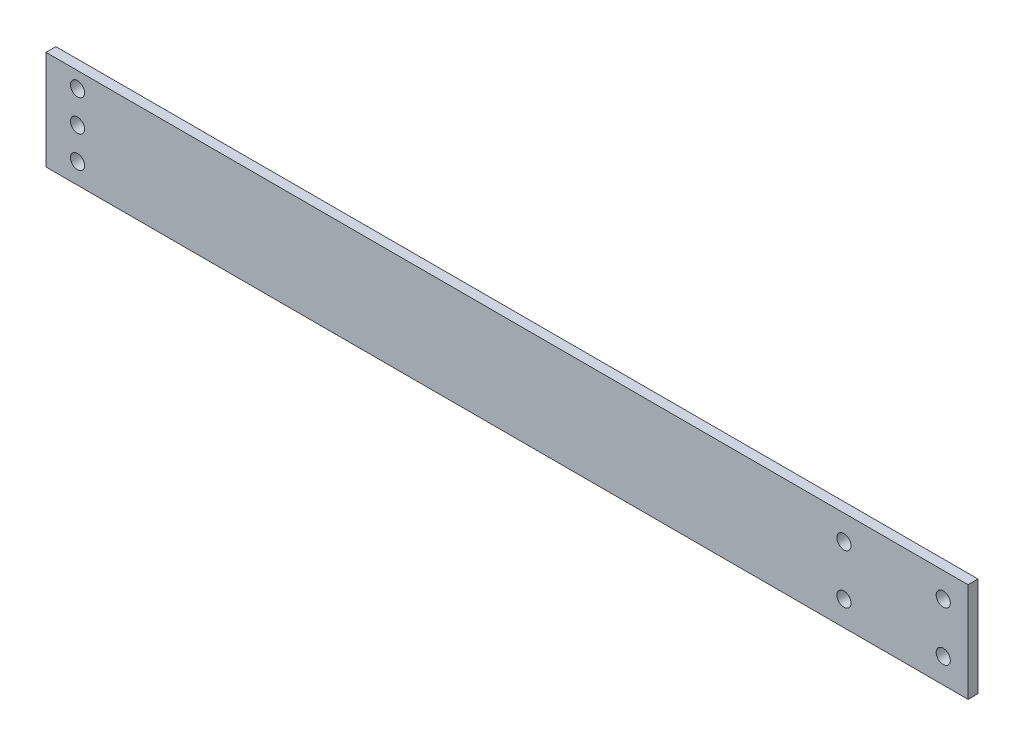
ISO-10303-21;
HEADER;
FILE_DESCRIPTION(('STEP AP214'),'2;1');
FILE_NAME('part.step','',(''),(''),'','','');
FILE_SCHEMA(('AUTOMOTIVE_DESIGN { 1 0 10303 214 1 1 1 1 }'));
ENDSEC;
DATA;
#1=APPLICATION_CONTEXT('core data for automotive mechanical design processes');
#2=APPLICATION_PROTOCOL_DEFINITION('international standard','automotive_design',2000,#1);
#3=PRODUCT_CONTEXT('',#1,'mechanical');
#4=PRODUCT('Part','Part','',(#3));
#5=PRODUCT_RELATED_PRODUCT_CATEGORY('part','',(#4));
#6=PRODUCT_DEFINITION_FORMATION('','',#4);
#7=PRODUCT_DEFINITION_CONTEXT('part definition',#1,'design');
#8=PRODUCT_DEFINITION('design','',#6,#7);
#9=PRODUCT_DEFINITION_SHAPE('','',#8);
#10=(LENGTH_UNIT() NAMED_UNIT(*) SI_UNIT(.MILLI.,.METRE.));
#11=(NAMED_UNIT(*) PLANE_ANGLE_UNIT() SI_UNIT($,.RADIAN.));
#12=(NAMED_UNIT(*) SI_UNIT($,.STERADIAN.) SOLID_ANGLE_UNIT());
#13=UNCERTAINTY_MEASURE_WITH_UNIT(LENGTH_MEASURE(1.E-05),#10,'distance_accuracy_value','');
#14=(GEOMETRIC_REPRESENTATION_CONTEXT(3) GLOBAL_UNCERTAINTY_ASSIGNED_CONTEXT((#13)) GLOBAL_UNIT_ASSIGNED_CONTEXT((#10,
#11,#12)) REPRESENTATION_CONTEXT('',''));
#15=CARTESIAN_POINT('',(0.,0.,0.));
#16=DIRECTION('',(0.,0.,1.));
#17=DIRECTION('',(1.,0.,0.));
#18=AXIS2_PLACEMENT_3D('',#15,#16,#17);
#19=CARTESIAN_POINT('',(92.855,-10.,2.));
#20=DIRECTION('',(-1.,0.,0.));
#21=DIRECTION('',(0.,0.,1.));
#22=AXIS2_PLACEMENT_3D('',#19,#20,#21);
#23=PLANE('',#22);
#24=DIRECTION('',(0.,1.,0.));
#25=VECTOR('',#24,1.);
#26=CARTESIAN_POINT('',(92.855,-10.,0.));
#27=LINE('',#26,#25);
#28=CARTESIAN_POINT('',(92.855,-10.,0.));
#29=VERTEX_POINT('',#28);
#30=CARTESIAN_POINT('',(92.855,10.,0.));
#31=VERTEX_POINT('',#30);
#32=EDGE_CURVE('E96',#29,#31,#27,.T.);
#33=ORIENTED_EDGE('',*,*,#32,.T.);
#34=DIRECTION('',(0.,0.,-1.));
#35=VECTOR('',#34,1.);
#36=CARTESIAN_POINT('',(92.855,10.,2.));
#37=LINE('',#36,#35);
#38=CARTESIAN_POINT('',(92.855,10.,2.));
#39=VERTEX_POINT('',#38);
#40=EDGE_CURVE('E11',#39,#31,#37,.T.);
#41=ORIENTED_EDGE('',*,*,#40,.F.);
#42=DIRECTION('',(0.,1.,0.));
#43=VECTOR('',#42,1.);
#44=CARTESIAN_POINT('',(92.855,-10.,2.));
#45=LINE('',#44,#43);
#46=CARTESIAN_POINT('',(92.855,-10.,2.));
#47=VERTEX_POINT('',#46);
#48=EDGE_CURVE('E84',#47,#39,#45,.T.);
#49=ORIENTED_EDGE('',*,*,#48,.F.);
#50=DIRECTION('',(0.,0.,-1.));
#51=VECTOR('',#50,1.);
#52=CARTESIAN_POINT('',(92.855,-10.,2.));
#53=LINE('',#52,#51);
#54=EDGE_CURVE('E92',#47,#29,#53,.T.);
#55=ORIENTED_EDGE('',*,*,#54,.T.);
#56=EDGE_LOOP('',(#33,#41,#49,#55));
#57=FACE_BOUND('',#56,.T.);
#58=ADVANCED_FACE('F33',(#57),#23,.F.);
#59=CARTESIAN_POINT('',(-92.8549999999999,10.,2.));
#60=DIRECTION('',(0.,-1.,0.));
#61=DIRECTION('',(0.,0.,-1.));
#62=AXIS2_PLACEMENT_3D('',#59,#60,#61);
#63=PLANE('',#62);
#64=DIRECTION('',(-1.,0.,0.));
#65=VECTOR('',#64,1.);
#66=CARTESIAN_POINT('',(-92.8549999999999,10.,0.));
#67=LINE('',#66,#65);
#68=CARTESIAN_POINT('',(-92.8549999999999,10.,0.));
#69=VERTEX_POINT('',#68);
#70=EDGE_CURVE('E88',#31,#69,#67,.T.);
#71=ORIENTED_EDGE('',*,*,#70,.T.);
#72=DIRECTION('',(0.,0.,-1.));
#73=VECTOR('',#72,1.);
#74=CARTESIAN_POINT('',(-92.8549999999999,10.,2.));
#75=LINE('',#74,#73);
#76=CARTESIAN_POINT('',(-92.8549999999999,10.,2.));
#77=VERTEX_POINT('',#76);
#78=EDGE_CURVE('E41',#77,#69,#75,.T.);
#79=ORIENTED_EDGE('',*,*,#78,.F.);
#80=DIRECTION('',(-1.,0.,0.));
#81=VECTOR('',#80,1.);
#82=CARTESIAN_POINT('',(-92.8549999999999,10.,2.));
#83=LINE('',#82,#81);
#84=EDGE_CURVE('E79',#39,#77,#83,.T.);
#85=ORIENTED_EDGE('',*,*,#84,.F.);
#86=ORIENTED_EDGE('',*,*,#40,.T.);
#87=EDGE_LOOP('',(#71,#79,#85,#86));
#88=FACE_BOUND('',#87,.T.);
#89=ADVANCED_FACE('F87',(#88),#63,.F.);
#90=CARTESIAN_POINT('',(-92.8549999999999,-10.,2.));
#91=DIRECTION('',(1.,0.,0.));
#92=DIRECTION('',(0.,0.,-1.));
#93=AXIS2_PLACEMENT_3D('',#90,#91,#92);
#94=PLANE('',#93);
#95=DIRECTION('',(0.,-1.,0.));
#96=VECTOR('',#95,1.);
#97=CARTESIAN_POINT('',(-92.8549999999999,-10.,0.));
#98=LINE('',#97,#96);
#99=CARTESIAN_POINT('',(-92.8549999999999,-10.,0.));
#100=VERTEX_POINT('',#99);
#101=EDGE_CURVE('E66',#69,#100,#98,.T.);
#102=ORIENTED_EDGE('',*,*,#101,.T.);
#103=DIRECTION('',(0.,0.,-1.));
#104=VECTOR('',#103,1.);
#105=CARTESIAN_POINT('',(-92.8549999999999,-10.,2.));
#106=LINE('',#105,#104);
#107=CARTESIAN_POINT('',(-92.8549999999999,-10.,2.));
#108=VERTEX_POINT('',#107);
#109=EDGE_CURVE('E89',#108,#100,#106,.T.);
#110=ORIENTED_EDGE('',*,*,#109,.F.);
#111=DIRECTION('',(0.,-1.,0.));
#112=VECTOR('',#111,1.);
#113=CARTESIAN_POINT('',(-92.8549999999999,-10.,2.));
#114=LINE('',#113,#112);
#115=EDGE_CURVE('E82',#77,#108,#114,.T.);
#116=ORIENTED_EDGE('',*,*,#115,.F.);
#117=ORIENTED_EDGE('',*,*,#78,.T.);
#118=EDGE_LOOP('',(#102,#110,#116,#117));
#119=FACE_BOUND('',#118,.T.);
#120=ADVANCED_FACE('F90',(#119),#94,.F.);
#121=CARTESIAN_POINT('',(-92.8549999999999,-10.,2.));
#122=DIRECTION('',(0.,1.,0.));
#123=DIRECTION('',(0.,0.,1.));
#124=AXIS2_PLACEMENT_3D('',#121,#122,#123);
#125=PLANE('',#124);
#126=DIRECTION('',(1.,0.,0.));
#127=VECTOR('',#126,1.);
#128=CARTESIAN_POINT('',(-92.8549999999999,-10.,0.));
#129=LINE('',#128,#127);
#130=EDGE_CURVE('E72',#100,#29,#129,.T.);
#131=ORIENTED_EDGE('',*,*,#130,.T.);
#132=ORIENTED_EDGE('',*,*,#54,.F.);
#133=DIRECTION('',(1.,0.,0.));
#134=VECTOR('',#133,1.);
#135=CARTESIAN_POINT('',(-92.8549999999999,-10.,2.));
#136=LINE('',#135,#134);
#137=EDGE_CURVE('E49',#108,#47,#136,.T.);
#138=ORIENTED_EDGE('',*,*,#137,.F.);
#139=ORIENTED_EDGE('',*,*,#109,.T.);
#140=EDGE_LOOP('',(#131,#132,#138,#139));
#141=FACE_BOUND('',#140,.T.);
#142=ADVANCED_FACE('F104',(#141),#125,.F.);
#143=CARTESIAN_POINT('',(0.,0.,2.));
#144=DIRECTION('',(0.,0.,-1.));
#145=DIRECTION('',(-1.,0.,0.));
#146=AXIS2_PLACEMENT_3D('',#143,#144,#145);
#147=PLANE('',#146);
#148=CARTESIAN_POINT('',(-86.5049999999999,0.475000000000001,2.));
#149=DIRECTION('',(0.,0.,1.));
#150=DIRECTION('',(1.,0.,0.));
#151=AXIS2_PLACEMENT_3D('',#148,#149,#150);
#152=CIRCLE('',#151,1.42240000000001);
#153=CARTESIAN_POINT('',(-85.0825999999999,0.475000000000001,2.));
#154=VERTEX_POINT('',#153);
#155=EDGE_CURVE('E113',#154,#154,#152,.T.);
#156=ORIENTED_EDGE('',*,*,#155,.F.);
#157=EDGE_LOOP('',(#156));
#158=FACE_BOUND('',#157,.T.);
#159=CARTESIAN_POINT('',(-86.5049999999998,-5.875,2.));
#160=DIRECTION('',(0.,0.,1.));
#161=DIRECTION('',(1.,0.,0.));
#162=AXIS2_PLACEMENT_3D('',#159,#160,#161);
#163=CIRCLE('',#162,1.42240000000001);
#164=CARTESIAN_POINT('',(-85.0825999999998,-5.875,2.));
#165=VERTEX_POINT('',#164);
#166=EDGE_CURVE('E132',#165,#165,#163,.T.);
#167=ORIENTED_EDGE('',*,*,#166,.F.);
#168=EDGE_LOOP('',(#167));
#169=FACE_BOUND('',#168,.T.);
#170=CARTESIAN_POINT('',(87.855,5.,2.));
#171=DIRECTION('',(0.,0.,1.));
#172=DIRECTION('',(1.,0.,0.));
#173=AXIS2_PLACEMENT_3D('',#170,#171,#172);
#174=CIRCLE('',#173,1.42240000000001);
#175=CARTESIAN_POINT('',(89.2774,5.,2.));
#176=VERTEX_POINT('',#175);
#177=EDGE_CURVE('E126',#176,#176,#174,.T.);
#178=ORIENTED_EDGE('',*,*,#177,.F.);
#179=EDGE_LOOP('',(#178));
#180=FACE_BOUND('',#179,.T.);
#181=CARTESIAN_POINT('',(67.855,4.99999999999986,2.));
#182=DIRECTION('',(0.,0.,1.));
#183=DIRECTION('',(1.,0.,0.));
#184=AXIS2_PLACEMENT_3D('',#181,#182,#183);
#185=CIRCLE('',#184,1.42240000000001);
#186=CARTESIAN_POINT('',(69.2774,4.99999999999986,2.));
#187=VERTEX_POINT('',#186);
#188=EDGE_CURVE('E119',#187,#187,#185,.T.);
#189=ORIENTED_EDGE('',*,*,#188,.F.);
#190=EDGE_LOOP('',(#189));
#191=FACE_BOUND('',#190,.T.);
#192=CARTESIAN_POINT('',(67.8550000000001,-5.00000000000014,2.));
#193=DIRECTION('',(0.,0.,1.));
#194=DIRECTION('',(1.,0.,0.));
#195=AXIS2_PLACEMENT_3D('',#192,#193,#194);
#196=CIRCLE('',#195,1.42240000000001);
#197=CARTESIAN_POINT('',(69.2774000000001,-5.00000000000014,2.));
#198=VERTEX_POINT('',#197);
#199=EDGE_CURVE('E120',#198,#198,#196,.T.);
#200=ORIENTED_EDGE('',*,*,#199,.F.);
#201=EDGE_LOOP('',(#200));
#202=FACE_BOUND('',#201,.T.);
#203=CARTESIAN_POINT('',(87.8550000000001,-5.,2.));
#204=DIRECTION('',(0.,0.,1.));
#205=DIRECTION('',(1.,0.,0.));
#206=AXIS2_PLACEMENT_3D('',#203,#204,#205);
#207=CIRCLE('',#206,1.42240000000001);
#208=CARTESIAN_POINT('',(89.2774000000001,-5.,2.));
#209=VERTEX_POINT('',#208);
#210=EDGE_CURVE('E143',#209,#209,#207,.T.);
#211=ORIENTED_EDGE('',*,*,#210,.F.);
#212=EDGE_LOOP('',(#211));
#213=FACE_BOUND('',#212,.T.);
#214=CARTESIAN_POINT('',(-86.505,6.825,2.));
#215=DIRECTION('',(0.,0.,1.));
#216=DIRECTION('',(1.,0.,0.));
#217=AXIS2_PLACEMENT_3D('',#214,#215,#216);
#218=CIRCLE('',#217,1.42240000000001);
#219=CARTESIAN_POINT('',(-85.0826,6.825,2.));
#220=VERTEX_POINT('',#219);
#221=EDGE_CURVE('E99',#220,#220,#218,.T.);
#222=ORIENTED_EDGE('',*,*,#221,.F.);
#223=EDGE_LOOP('',(#222));
#224=FACE_BOUND('',#223,.T.);
#225=ORIENTED_EDGE('',*,*,#48,.T.);
#226=ORIENTED_EDGE('',*,*,#84,.T.);
#227=ORIENTED_EDGE('',*,*,#115,.T.);
#228=ORIENTED_EDGE('',*,*,#137,.T.);
#229=EDGE_LOOP('',(#225,#226,#227,#228));
#230=FACE_BOUND('',#229,.T.);
#231=ADVANCED_FACE('F80',(#158,#169,#180,#191,#202,#213,#224,#230),#147,.F.);
#232=CARTESIAN_POINT('',(0.,0.,0.));
#233=DIRECTION('',(0.,0.,-1.));
#234=DIRECTION('',(-1.,0.,0.));
#235=AXIS2_PLACEMENT_3D('',#232,#233,#234);
#236=PLANE('',#235);
#237=CARTESIAN_POINT('',(-86.5049999999999,0.475000000000001,0.));
#238=DIRECTION('',(0.,0.,-1.));
#239=DIRECTION('',(-1.,0.,0.));
#240=AXIS2_PLACEMENT_3D('',#237,#238,#239);
#241=CIRCLE('',#240,1.42240000000001);
#242=CARTESIAN_POINT('',(-87.9273999999999,0.475000000000001,0.));
#243=VERTEX_POINT('',#242);
#244=EDGE_CURVE('E135',#243,#243,#241,.F.);
#245=ORIENTED_EDGE('',*,*,#244,.T.);
#246=EDGE_LOOP('',(#245));
#247=FACE_BOUND('',#246,.T.);
#248=CARTESIAN_POINT('',(-86.5049999999998,-5.875,0.));
#249=DIRECTION('',(0.,0.,-1.));
#250=DIRECTION('',(-1.,0.,0.));
#251=AXIS2_PLACEMENT_3D('',#248,#249,#250);
#252=CIRCLE('',#251,1.42240000000001);
#253=CARTESIAN_POINT('',(-87.9273999999998,-5.875,0.));
#254=VERTEX_POINT('',#253);
#255=EDGE_CURVE('E129',#254,#254,#252,.F.);
#256=ORIENTED_EDGE('',*,*,#255,.T.);
#257=EDGE_LOOP('',(#256));
#258=FACE_BOUND('',#257,.T.);
#259=CARTESIAN_POINT('',(87.855,5.,0.));
#260=DIRECTION('',(0.,0.,-1.));
#261=DIRECTION('',(-1.,0.,0.));
#262=AXIS2_PLACEMENT_3D('',#259,#260,#261);
#263=CIRCLE('',#262,1.42240000000001);
#264=CARTESIAN_POINT('',(86.4326,5.,0.));
#265=VERTEX_POINT('',#264);
#266=EDGE_CURVE('E123',#265,#265,#263,.F.);
#267=ORIENTED_EDGE('',*,*,#266,.T.);
#268=EDGE_LOOP('',(#267));
#269=FACE_BOUND('',#268,.T.);
#270=CARTESIAN_POINT('',(67.855,4.99999999999986,0.));
#271=DIRECTION('',(0.,0.,-1.));
#272=DIRECTION('',(-1.,0.,0.));
#273=AXIS2_PLACEMENT_3D('',#270,#271,#272);
#274=CIRCLE('',#273,1.42240000000001);
#275=CARTESIAN_POINT('',(66.4326,4.99999999999986,0.));
#276=VERTEX_POINT('',#275);
#277=EDGE_CURVE('E116',#276,#276,#274,.F.);
#278=ORIENTED_EDGE('',*,*,#277,.T.);
#279=EDGE_LOOP('',(#278));
#280=FACE_BOUND('',#279,.T.);
#281=CARTESIAN_POINT('',(67.8550000000001,-5.00000000000014,0.));
#282=DIRECTION('',(0.,0.,-1.));
#283=DIRECTION('',(-1.,0.,0.));
#284=AXIS2_PLACEMENT_3D('',#281,#282,#283);
#285=CIRCLE('',#284,1.42240000000001);
#286=CARTESIAN_POINT('',(66.4326000000001,-5.00000000000014,0.));
#287=VERTEX_POINT('',#286);
#288=EDGE_CURVE('E146',#287,#287,#285,.F.);
#289=ORIENTED_EDGE('',*,*,#288,.T.);
#290=EDGE_LOOP('',(#289));
#291=FACE_BOUND('',#290,.T.);
#292=CARTESIAN_POINT('',(87.8550000000001,-5.,0.));
#293=DIRECTION('',(0.,0.,-1.));
#294=DIRECTION('',(-1.,0.,0.));
#295=AXIS2_PLACEMENT_3D('',#292,#293,#294);
#296=CIRCLE('',#295,1.42240000000001);
#297=CARTESIAN_POINT('',(86.4326000000001,-5.,0.));
#298=VERTEX_POINT('',#297);
#299=EDGE_CURVE('E140',#298,#298,#296,.F.);
#300=ORIENTED_EDGE('',*,*,#299,.T.);
#301=EDGE_LOOP('',(#300));
#302=FACE_BOUND('',#301,.T.);
#303=CARTESIAN_POINT('',(-86.505,6.825,0.));
#304=DIRECTION('',(0.,0.,-1.));
#305=DIRECTION('',(-1.,0.,0.));
#306=AXIS2_PLACEMENT_3D('',#303,#304,#305);
#307=CIRCLE('',#306,1.42240000000001);
#308=CARTESIAN_POINT('',(-87.9274,6.825,0.));
#309=VERTEX_POINT('',#308);
#310=EDGE_CURVE('E110',#309,#309,#307,.F.);
#311=ORIENTED_EDGE('',*,*,#310,.T.);
#312=EDGE_LOOP('',(#311));
#313=FACE_BOUND('',#312,.T.);
#314=ORIENTED_EDGE('',*,*,#32,.F.);
#315=ORIENTED_EDGE('',*,*,#130,.F.);
#316=ORIENTED_EDGE('',*,*,#101,.F.);
#317=ORIENTED_EDGE('',*,*,#70,.F.);
#318=EDGE_LOOP('',(#314,#315,#316,#317));
#319=FACE_BOUND('',#318,.T.);
#320=ADVANCED_FACE('F107',(#247,#258,#269,#280,#291,#302,#313,#319),#236,.T.);
#321=CARTESIAN_POINT('',(-86.505,6.825,-0.00100000000000013));
#322=DIRECTION('',(0.,0.,1.));
#323=DIRECTION('',(1.,0.,0.));
#324=AXIS2_PLACEMENT_3D('',#321,#322,#323);
#325=CYLINDRICAL_SURFACE('',#324,1.42240000000001);
#326=ORIENTED_EDGE('',*,*,#310,.F.);
#327=EDGE_LOOP('',(#326));
#328=FACE_BOUND('',#327,.T.);
#329=ORIENTED_EDGE('',*,*,#221,.T.);
#330=EDGE_LOOP('',(#329));
#331=FACE_BOUND('',#330,.T.);
#332=ADVANCED_FACE('F162',(#328,#331),#325,.F.);
#333=CARTESIAN_POINT('',(87.8550000000001,-5.,-0.00100000000000013));
#334=DIRECTION('',(0.,0.,1.));
#335=DIRECTION('',(1.,0.,0.));
#336=AXIS2_PLACEMENT_3D('',#333,#334,#335);
#337=CYLINDRICAL_SURFACE('',#336,1.42240000000001);
#338=ORIENTED_EDGE('',*,*,#299,.F.);
#339=EDGE_LOOP('',(#338));
#340=FACE_BOUND('',#339,.T.);
#341=ORIENTED_EDGE('',*,*,#210,.T.);
#342=EDGE_LOOP('',(#341));
#343=FACE_BOUND('',#342,.T.);
#344=ADVANCED_FACE('F164',(#340,#343),#337,.F.);
#345=CARTESIAN_POINT('',(67.8550000000001,-5.00000000000014,-0.00100000000000013));
#346=DIRECTION('',(0.,0.,1.));
#347=DIRECTION('',(1.,0.,0.));
#348=AXIS2_PLACEMENT_3D('',#345,#346,#347);
#349=CYLINDRICAL_SURFACE('',#348,1.42240000000001);
#350=ORIENTED_EDGE('',*,*,#288,.F.);
#351=EDGE_LOOP('',(#350));
#352=FACE_BOUND('',#351,.T.);
#353=ORIENTED_EDGE('',*,*,#199,.T.);
#354=EDGE_LOOP('',(#353));
#355=FACE_BOUND('',#354,.T.);
#356=ADVANCED_FACE('F152',(#352,#355),#349,.F.);
#357=CARTESIAN_POINT('',(67.855,4.99999999999986,-0.00100000000000013));
#358=DIRECTION('',(0.,0.,1.));
#359=DIRECTION('',(1.,0.,0.));
#360=AXIS2_PLACEMENT_3D('',#357,#358,#359);
#361=CYLINDRICAL_SURFACE('',#360,1.42240000000001);
#362=ORIENTED_EDGE('',*,*,#277,.F.);
#363=EDGE_LOOP('',(#362));
#364=FACE_BOUND('',#363,.T.);
#365=ORIENTED_EDGE('',*,*,#188,.T.);
#366=EDGE_LOOP('',(#365));
#367=FACE_BOUND('',#366,.T.);
#368=ADVANCED_FACE('F218',(#364,#367),#361,.F.);
#369=CARTESIAN_POINT('',(87.855,5.,-0.00100000000000013));
#370=DIRECTION('',(0.,0.,1.));
#371=DIRECTION('',(1.,0.,0.));
#372=AXIS2_PLACEMENT_3D('',#369,#370,#371);
#373=CYLINDRICAL_SURFACE('',#372,1.42240000000001);
#374=ORIENTED_EDGE('',*,*,#266,.F.);
#375=EDGE_LOOP('',(#374));
#376=FACE_BOUND('',#375,.T.);
#377=ORIENTED_EDGE('',*,*,#177,.T.);
#378=EDGE_LOOP('',(#377));
#379=FACE_BOUND('',#378,.T.);
#380=ADVANCED_FACE('F228',(#376,#379),#373,.F.);
#381=CARTESIAN_POINT('',(-86.5049999999998,-5.875,-0.00100000000000013));
#382=DIRECTION('',(0.,0.,1.));
#383=DIRECTION('',(1.,0.,0.));
#384=AXIS2_PLACEMENT_3D('',#381,#382,#383);
#385=CYLINDRICAL_SURFACE('',#384,1.42240000000001);
#386=ORIENTED_EDGE('',*,*,#255,.F.);
#387=EDGE_LOOP('',(#386));
#388=FACE_BOUND('',#387,.T.);
#389=ORIENTED_EDGE('',*,*,#166,.T.);
#390=EDGE_LOOP('',(#389));
#391=FACE_BOUND('',#390,.T.);
#392=ADVANCED_FACE('F237',(#388,#391),#385,.F.);
#393=CARTESIAN_POINT('',(-86.5049999999999,0.475000000000001,-0.00100000000000013));
#394=DIRECTION('',(0.,0.,1.));
#395=DIRECTION('',(1.,0.,0.));
#396=AXIS2_PLACEMENT_3D('',#393,#394,#395);
#397=CYLINDRICAL_SURFACE('',#396,1.42240000000001);
#398=ORIENTED_EDGE('',*,*,#244,.F.);
#399=EDGE_LOOP('',(#398));
#400=FACE_BOUND('',#399,.T.);
#401=ORIENTED_EDGE('',*,*,#155,.T.);
#402=EDGE_LOOP('',(#401));
#403=FACE_BOUND('',#402,.T.);
#404=ADVANCED_FACE('F247',(#400,#403),#397,.F.);
#405=CLOSED_SHELL('',(#58,#89,#120,#142,#231,#320,#332,#344,#356,#368,#380,#392,#404));
#406=MANIFOLD_SOLID_BREP('B2',#405);
#407=ADVANCED_BREP_SHAPE_REPRESENTATION('',(#18,#406),#14);
#408=SHAPE_DEFINITION_REPRESENTATION(#9,#407);
ENDSEC;
END-ISO-10303-21;
